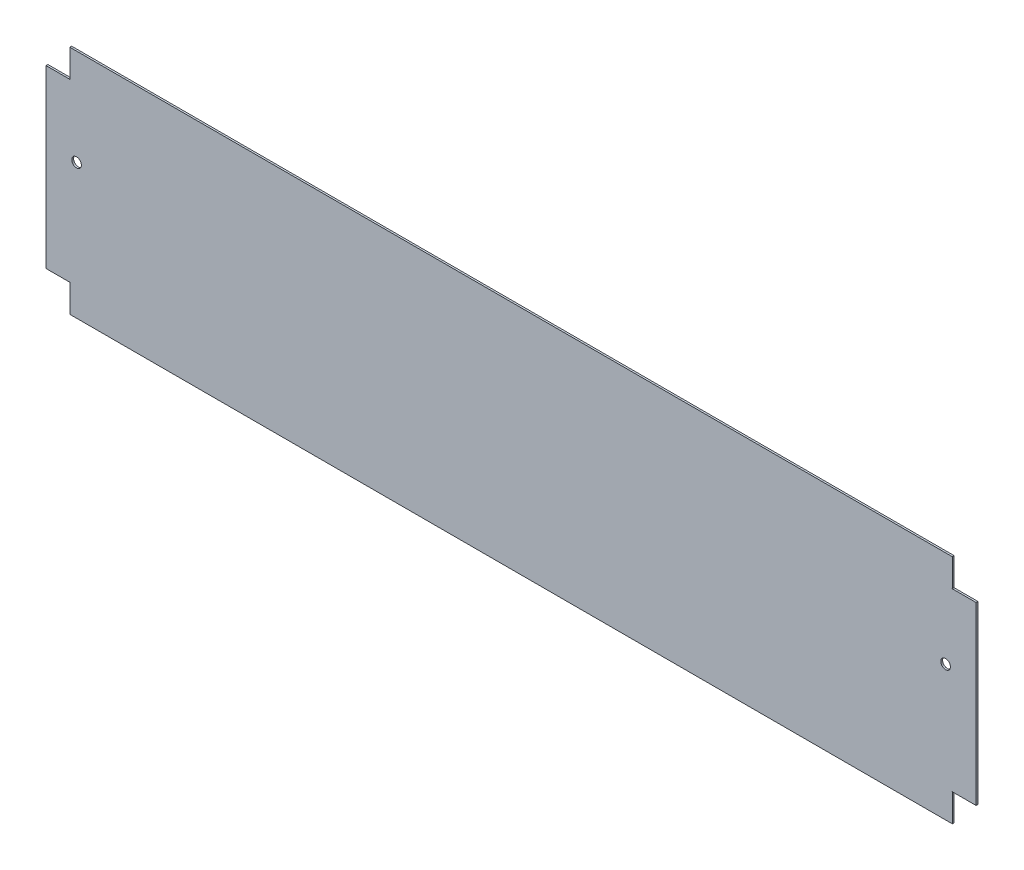
ISO-10303-21;
HEADER;
FILE_DESCRIPTION(('STEP AP214'),'2;1');
FILE_NAME('part.step','',(''),(''),'','','');
FILE_SCHEMA(('AUTOMOTIVE_DESIGN { 1 0 10303 214 1 1 1 1 }'));
ENDSEC;
DATA;
#1=APPLICATION_CONTEXT('core data for automotive mechanical design processes');
#2=APPLICATION_PROTOCOL_DEFINITION('international standard','automotive_design',2000,#1);
#3=PRODUCT_CONTEXT('',#1,'mechanical');
#4=PRODUCT('Part','Part','',(#3));
#5=PRODUCT_RELATED_PRODUCT_CATEGORY('part','',(#4));
#6=PRODUCT_DEFINITION_FORMATION('','',#4);
#7=PRODUCT_DEFINITION_CONTEXT('part definition',#1,'design');
#8=PRODUCT_DEFINITION('design','',#6,#7);
#9=PRODUCT_DEFINITION_SHAPE('','',#8);
#10=(LENGTH_UNIT() NAMED_UNIT(*) SI_UNIT(.MILLI.,.METRE.));
#11=(NAMED_UNIT(*) PLANE_ANGLE_UNIT() SI_UNIT($,.RADIAN.));
#12=(NAMED_UNIT(*) SI_UNIT($,.STERADIAN.) SOLID_ANGLE_UNIT());
#13=UNCERTAINTY_MEASURE_WITH_UNIT(LENGTH_MEASURE(1.E-05),#10,'distance_accuracy_value','');
#14=(GEOMETRIC_REPRESENTATION_CONTEXT(3) GLOBAL_UNCERTAINTY_ASSIGNED_CONTEXT((#13)) GLOBAL_UNIT_ASSIGNED_CONTEXT((#10,
#11,#12)) REPRESENTATION_CONTEXT('',''));
#15=CARTESIAN_POINT('',(0.,0.,0.));
#16=DIRECTION('',(0.,0.,1.));
#17=DIRECTION('',(1.,0.,0.));
#18=AXIS2_PLACEMENT_3D('',#15,#16,#17);
#19=CARTESIAN_POINT('',(0.,0.,-1.524));
#20=DIRECTION('',(0.,0.,-1.));
#21=DIRECTION('',(-1.,0.,0.));
#22=AXIS2_PLACEMENT_3D('',#19,#20,#21);
#23=PLANE('',#22);
#24=CARTESIAN_POINT('',(-357.251,15.875,-1.524));
#25=DIRECTION('',(0.,0.,-1.));
#26=DIRECTION('',(-1.,0.,0.));
#27=AXIS2_PLACEMENT_3D('',#24,#25,#26);
#28=CIRCLE('',#27,3.9624);
#29=CARTESIAN_POINT('',(-361.2134,15.875,-1.524));
#30=VERTEX_POINT('',#29);
#31=EDGE_CURVE('E367',#30,#30,#28,.T.);
#32=ORIENTED_EDGE('',*,*,#31,.F.);
#33=EDGE_LOOP('',(#32));
#34=FACE_BOUND('',#33,.T.);
#35=CARTESIAN_POINT('',(357.251,15.875,-1.524));
#36=DIRECTION('',(0.,0.,-1.));
#37=DIRECTION('',(-1.,0.,0.));
#38=AXIS2_PLACEMENT_3D('',#35,#36,#37);
#39=CIRCLE('',#38,3.9624);
#40=CARTESIAN_POINT('',(353.2886,15.875,-1.524));
#41=VERTEX_POINT('',#40);
#42=EDGE_CURVE('E360',#41,#41,#39,.T.);
#43=ORIENTED_EDGE('',*,*,#42,.F.);
#44=EDGE_LOOP('',(#43));
#45=FACE_BOUND('',#44,.T.);
#46=DIRECTION('',(0.,-1.,0.));
#47=VECTOR('',#46,1.);
#48=CARTESIAN_POINT('',(-362.6866,72.4153999999998,-1.52400000000003));
#49=LINE('',#48,#47);
#50=CARTESIAN_POINT('',(-362.6866,72.4153999999998,-1.524));
#51=VERTEX_POINT('',#50);
#52=CARTESIAN_POINT('',(-362.6866,72.2629999999998,-1.524));
#53=VERTEX_POINT('',#52);
#54=EDGE_CURVE('E152',#51,#53,#49,.T.);
#55=ORIENTED_EDGE('',*,*,#54,.F.);
#56=DIRECTION('',(1.,0.,0.));
#57=VECTOR('',#56,1.);
#58=CARTESIAN_POINT('',(-365.887,72.4153999999998,-1.52400000000003));
#59=LINE('',#58,#57);
#60=CARTESIAN_POINT('',(-362.7628,72.4153999999998,-1.524));
#61=VERTEX_POINT('',#60);
#62=EDGE_CURVE('E372',#61,#51,#59,.T.);
#63=ORIENTED_EDGE('',*,*,#62,.F.);
#64=DIRECTION('',(0.,1.,0.));
#65=VECTOR('',#64,1.);
#66=CARTESIAN_POINT('',(-362.7628,78.613,-1.524));
#67=LINE('',#66,#65);
#68=CARTESIAN_POINT('',(-362.7628,95.1099625310125,-1.5239999999999));
#69=VERTEX_POINT('',#68);
#70=EDGE_CURVE('E289',#61,#69,#67,.T.);
#71=ORIENTED_EDGE('',*,*,#70,.T.);
#72=DIRECTION('',(1.,0.,0.));
#73=VECTOR('',#72,1.);
#74=CARTESIAN_POINT('',(-362.7628,95.1099625310125,-1.5239999999999));
#75=LINE('',#74,#73);
#76=CARTESIAN_POINT('',(362.7628,95.1099625310125,-1.5239999999999));
#77=VERTEX_POINT('',#76);
#78=EDGE_CURVE('E287',#77,#69,#75,.F.);
#79=ORIENTED_EDGE('',*,*,#78,.F.);
#80=DIRECTION('',(0.,-1.,0.));
#81=VECTOR('',#80,1.);
#82=CARTESIAN_POINT('',(362.7628,78.613,-1.524));
#83=LINE('',#82,#81);
#84=CARTESIAN_POINT('',(362.7628,72.4153999999999,-1.52400000000003));
#85=VERTEX_POINT('',#84);
#86=EDGE_CURVE('E274',#77,#85,#83,.T.);
#87=ORIENTED_EDGE('',*,*,#86,.T.);
#88=DIRECTION('',(1.,0.,0.));
#89=VECTOR('',#88,1.);
#90=CARTESIAN_POINT('',(362.6866,72.4153999999999,-1.52400000000003));
#91=LINE('',#90,#89);
#92=CARTESIAN_POINT('',(362.6866,72.4153999999999,-1.52400000000003));
#93=VERTEX_POINT('',#92);
#94=EDGE_CURVE('E423',#93,#85,#91,.T.);
#95=ORIENTED_EDGE('',*,*,#94,.F.);
#96=DIRECTION('',(0.,1.,0.));
#97=VECTOR('',#96,1.);
#98=CARTESIAN_POINT('',(362.6866,72.2629999999999,-1.52400000000003));
#99=LINE('',#98,#97);
#100=CARTESIAN_POINT('',(362.6866,72.2629999999999,-1.52400000000003));
#101=VERTEX_POINT('',#100);
#102=EDGE_CURVE('E417',#101,#93,#99,.T.);
#103=ORIENTED_EDGE('',*,*,#102,.F.);
#104=DIRECTION('',(1.,0.,0.));
#105=VECTOR('',#104,1.);
#106=CARTESIAN_POINT('',(365.887,72.263,-1.524));
#107=LINE('',#106,#105);
#108=CARTESIAN_POINT('',(382.383962531012,72.2630000000003,-1.52399999999991));
#109=VERTEX_POINT('',#108);
#110=EDGE_CURVE('E284',#101,#109,#107,.T.);
#111=ORIENTED_EDGE('',*,*,#110,.T.);
#112=DIRECTION('',(0.,-1.,0.));
#113=VECTOR('',#112,1.);
#114=CARTESIAN_POINT('',(382.383962531012,72.2630000000003,-1.52399999999991));
#115=LINE('',#114,#113);
#116=CARTESIAN_POINT('',(382.383962531012,-72.2629999999997,-1.5239999999998));
#117=VERTEX_POINT('',#116);
#118=EDGE_CURVE('E320',#117,#109,#115,.F.);
#119=ORIENTED_EDGE('',*,*,#118,.F.);
#120=DIRECTION('',(-1.,0.,0.));
#121=VECTOR('',#120,1.);
#122=CARTESIAN_POINT('',(365.887,-72.263,-1.524));
#123=LINE('',#122,#121);
#124=CARTESIAN_POINT('',(362.6866,-72.263,-1.524));
#125=VERTEX_POINT('',#124);
#126=EDGE_CURVE('E449',#117,#125,#123,.T.);
#127=ORIENTED_EDGE('',*,*,#126,.T.);
#128=DIRECTION('',(0.,1.,0.));
#129=VECTOR('',#128,1.);
#130=CARTESIAN_POINT('',(362.6866,-72.4154,-1.52400000000003));
#131=LINE('',#130,#129);
#132=CARTESIAN_POINT('',(362.6866,-72.4154,-1.524));
#133=VERTEX_POINT('',#132);
#134=EDGE_CURVE('E412',#133,#125,#131,.T.);
#135=ORIENTED_EDGE('',*,*,#134,.F.);
#136=DIRECTION('',(-1.,0.,0.));
#137=VECTOR('',#136,1.);
#138=CARTESIAN_POINT('',(365.887,-72.4154,-1.52400000000003));
#139=LINE('',#138,#137);
#140=CARTESIAN_POINT('',(362.7628,-72.4154,-1.524));
#141=VERTEX_POINT('',#140);
#142=EDGE_CURVE('E407',#141,#133,#139,.T.);
#143=ORIENTED_EDGE('',*,*,#142,.F.);
#144=DIRECTION('',(0.,-1.,0.));
#145=VECTOR('',#144,1.);
#146=CARTESIAN_POINT('',(362.7628,-78.613,-1.524));
#147=LINE('',#146,#145);
#148=CARTESIAN_POINT('',(362.7628,-95.1099625310125,-1.52399999999989));
#149=VERTEX_POINT('',#148);
#150=EDGE_CURVE('E444',#141,#149,#147,.T.);
#151=ORIENTED_EDGE('',*,*,#150,.T.);
#152=DIRECTION('',(-1.,0.,0.));
#153=VECTOR('',#152,1.);
#154=CARTESIAN_POINT('',(362.7628,-95.1099625310125,-1.52399999999989));
#155=LINE('',#154,#153);
#156=CARTESIAN_POINT('',(-362.7628,-95.1099625310125,-1.5239999999999));
#157=VERTEX_POINT('',#156);
#158=EDGE_CURVE('E311',#157,#149,#155,.F.);
#159=ORIENTED_EDGE('',*,*,#158,.F.);
#160=DIRECTION('',(0.,1.,0.));
#161=VECTOR('',#160,1.);
#162=CARTESIAN_POINT('',(-362.7628,-78.613,-1.524));
#163=LINE('',#162,#161);
#164=CARTESIAN_POINT('',(-362.7628,-72.4154,-1.52400000000003));
#165=VERTEX_POINT('',#164);
#166=EDGE_CURVE('E460',#157,#165,#163,.T.);
#167=ORIENTED_EDGE('',*,*,#166,.T.);
#168=DIRECTION('',(-1.,0.,0.));
#169=VECTOR('',#168,1.);
#170=CARTESIAN_POINT('',(-362.6866,-72.4154,-1.52400000000003));
#171=LINE('',#170,#169);
#172=CARTESIAN_POINT('',(-362.6866,-72.4154,-1.52400000000003));
#173=VERTEX_POINT('',#172);
#174=EDGE_CURVE('E385',#173,#165,#171,.T.);
#175=ORIENTED_EDGE('',*,*,#174,.F.);
#176=DIRECTION('',(0.,-1.,0.));
#177=VECTOR('',#176,1.);
#178=CARTESIAN_POINT('',(-362.6866,-72.263,-1.52400000000003));
#179=LINE('',#178,#177);
#180=CARTESIAN_POINT('',(-362.6866,-72.263,-1.52400000000003));
#181=VERTEX_POINT('',#180);
#182=EDGE_CURVE('E379',#181,#173,#179,.T.);
#183=ORIENTED_EDGE('',*,*,#182,.F.);
#184=DIRECTION('',(-1.,0.,0.));
#185=VECTOR('',#184,1.);
#186=CARTESIAN_POINT('',(-365.887,-72.2630000000001,-1.524));
#187=LINE('',#186,#185);
#188=CARTESIAN_POINT('',(-382.383962531012,-72.2630000000004,-1.52399999999991));
#189=VERTEX_POINT('',#188);
#190=EDGE_CURVE('E465',#181,#189,#187,.T.);
#191=ORIENTED_EDGE('',*,*,#190,.T.);
#192=DIRECTION('',(0.,1.,0.));
#193=VECTOR('',#192,1.);
#194=CARTESIAN_POINT('',(-382.383962531012,-72.2630000000004,-1.52399999999991));
#195=LINE('',#194,#193);
#196=CARTESIAN_POINT('',(-382.383962531012,72.2629999999996,-1.5239999999998));
#197=VERTEX_POINT('',#196);
#198=EDGE_CURVE('E328',#197,#189,#195,.F.);
#199=ORIENTED_EDGE('',*,*,#198,.F.);
#200=DIRECTION('',(1.,0.,0.));
#201=VECTOR('',#200,1.);
#202=CARTESIAN_POINT('',(-365.887,72.2629999999999,-1.524));
#203=LINE('',#202,#201);
#204=EDGE_CURVE('E157',#197,#53,#203,.T.);
#205=ORIENTED_EDGE('',*,*,#204,.T.);
#206=EDGE_LOOP('',(#55,#63,#71,#79,#87,#95,#103,#111,#119,#127,#135,#143,#151,#159,#167,#175,
#183,#191,#199,#205));
#207=FACE_BOUND('',#206,.T.);
#208=ADVANCED_FACE('F136',(#34,#45,#207),#23,.T.);
#209=CARTESIAN_POINT('',(0.,0.,0.));
#210=DIRECTION('',(0.,0.,-1.));
#211=DIRECTION('',(-1.,0.,0.));
#212=AXIS2_PLACEMENT_3D('',#209,#210,#211);
#213=PLANE('',#212);
#214=CARTESIAN_POINT('',(-357.251,15.875,0.));
#215=DIRECTION('',(0.,0.,1.));
#216=DIRECTION('',(1.,0.,0.));
#217=AXIS2_PLACEMENT_3D('',#214,#215,#216);
#218=CIRCLE('',#217,3.9624);
#219=CARTESIAN_POINT('',(-353.2886,15.875,0.));
#220=VERTEX_POINT('',#219);
#221=EDGE_CURVE('E356',#220,#220,#218,.T.);
#222=ORIENTED_EDGE('',*,*,#221,.F.);
#223=EDGE_LOOP('',(#222));
#224=FACE_BOUND('',#223,.T.);
#225=CARTESIAN_POINT('',(357.251,15.875,0.));
#226=DIRECTION('',(0.,0.,1.));
#227=DIRECTION('',(1.,0.,0.));
#228=AXIS2_PLACEMENT_3D('',#225,#226,#227);
#229=CIRCLE('',#228,3.9624);
#230=CARTESIAN_POINT('',(361.2134,15.875,0.));
#231=VERTEX_POINT('',#230);
#232=EDGE_CURVE('E344',#231,#231,#229,.T.);
#233=ORIENTED_EDGE('',*,*,#232,.F.);
#234=EDGE_LOOP('',(#233));
#235=FACE_BOUND('',#234,.T.);
#236=DIRECTION('',(-1.,0.,0.));
#237=VECTOR('',#236,1.);
#238=CARTESIAN_POINT('',(0.,72.4153999999998,0.));
#239=LINE('',#238,#237);
#240=CARTESIAN_POINT('',(-362.6866,72.4153999999998,0.));
#241=VERTEX_POINT('',#240);
#242=CARTESIAN_POINT('',(-362.7628,72.4153999999998,0.));
#243=VERTEX_POINT('',#242);
#244=EDGE_CURVE('E375',#241,#243,#239,.T.);
#245=ORIENTED_EDGE('',*,*,#244,.F.);
#246=DIRECTION('',(0.,1.,0.));
#247=VECTOR('',#246,1.);
#248=CARTESIAN_POINT('',(-362.6866,0.,0.));
#249=LINE('',#248,#247);
#250=CARTESIAN_POINT('',(-362.6866,72.2629999999998,0.));
#251=VERTEX_POINT('',#250);
#252=EDGE_CURVE('E13',#251,#241,#249,.T.);
#253=ORIENTED_EDGE('',*,*,#252,.F.);
#254=DIRECTION('',(1.,0.,0.));
#255=VECTOR('',#254,1.);
#256=CARTESIAN_POINT('',(-365.887,72.2629999999999,0.));
#257=LINE('',#256,#255);
#258=CARTESIAN_POINT('',(-382.383962531012,72.2629999999996,2.22044604925031E-13));
#259=VERTEX_POINT('',#258);
#260=EDGE_CURVE('E464',#259,#251,#257,.T.);
#261=ORIENTED_EDGE('',*,*,#260,.F.);
#262=DIRECTION('',(0.,-1.,0.));
#263=VECTOR('',#262,1.);
#264=CARTESIAN_POINT('',(-382.383962531012,-2.81067885232432E-13,1.66533453693773E-13));
#265=LINE('',#264,#263);
#266=CARTESIAN_POINT('',(-382.383962531012,-72.2630000000004,1.11022302462516E-13));
#267=VERTEX_POINT('',#266);
#268=EDGE_CURVE('E340',#259,#267,#265,.T.);
#269=ORIENTED_EDGE('',*,*,#268,.T.);
#270=DIRECTION('',(-1.,0.,0.));
#271=VECTOR('',#270,1.);
#272=CARTESIAN_POINT('',(-365.887,-72.2630000000001,0.));
#273=LINE('',#272,#271);
#274=CARTESIAN_POINT('',(-362.6866,-72.263,0.));
#275=VERTEX_POINT('',#274);
#276=EDGE_CURVE('E456',#275,#267,#273,.T.);
#277=ORIENTED_EDGE('',*,*,#276,.F.);
#278=DIRECTION('',(0.,1.,0.));
#279=VECTOR('',#278,1.);
#280=CARTESIAN_POINT('',(-362.6866,0.,0.));
#281=LINE('',#280,#279);
#282=CARTESIAN_POINT('',(-362.6866,-72.4154,0.));
#283=VERTEX_POINT('',#282);
#284=EDGE_CURVE('E145',#283,#275,#281,.T.);
#285=ORIENTED_EDGE('',*,*,#284,.F.);
#286=DIRECTION('',(1.,0.,0.));
#287=VECTOR('',#286,1.);
#288=CARTESIAN_POINT('',(0.,-72.4154,0.));
#289=LINE('',#288,#287);
#290=CARTESIAN_POINT('',(-362.7628,-72.4154,0.));
#291=VERTEX_POINT('',#290);
#292=EDGE_CURVE('E403',#291,#283,#289,.T.);
#293=ORIENTED_EDGE('',*,*,#292,.F.);
#294=DIRECTION('',(0.,1.,0.));
#295=VECTOR('',#294,1.);
#296=CARTESIAN_POINT('',(-362.7628,-78.613,0.));
#297=LINE('',#296,#295);
#298=CARTESIAN_POINT('',(-362.7628,-95.1099625310124,0.));
#299=VERTEX_POINT('',#298);
#300=EDGE_CURVE('E459',#299,#291,#297,.T.);
#301=ORIENTED_EDGE('',*,*,#300,.F.);
#302=DIRECTION('',(1.,0.,0.));
#303=VECTOR('',#302,1.);
#304=CARTESIAN_POINT('',(0.,-95.1099625310124,0.));
#305=LINE('',#304,#303);
#306=CARTESIAN_POINT('',(362.7628,-95.1099625310124,1.11022302462516E-13));
#307=VERTEX_POINT('',#306);
#308=EDGE_CURVE('E324',#299,#307,#305,.T.);
#309=ORIENTED_EDGE('',*,*,#308,.T.);
#310=DIRECTION('',(0.,-1.,0.));
#311=VECTOR('',#310,1.);
#312=CARTESIAN_POINT('',(362.7628,-78.613,0.));
#313=LINE('',#312,#311);
#314=CARTESIAN_POINT('',(362.7628,-72.4154,0.));
#315=VERTEX_POINT('',#314);
#316=EDGE_CURVE('E445',#315,#307,#313,.T.);
#317=ORIENTED_EDGE('',*,*,#316,.F.);
#318=DIRECTION('',(1.,0.,0.));
#319=VECTOR('',#318,1.);
#320=CARTESIAN_POINT('',(0.,-72.4154,0.));
#321=LINE('',#320,#319);
#322=CARTESIAN_POINT('',(362.6866,-72.4154,0.));
#323=VERTEX_POINT('',#322);
#324=EDGE_CURVE('E411',#323,#315,#321,.T.);
#325=ORIENTED_EDGE('',*,*,#324,.F.);
#326=DIRECTION('',(0.,-1.,0.));
#327=VECTOR('',#326,1.);
#328=CARTESIAN_POINT('',(362.6866,0.,0.));
#329=LINE('',#328,#327);
#330=CARTESIAN_POINT('',(362.6866,-72.263,0.));
#331=VERTEX_POINT('',#330);
#332=EDGE_CURVE('E497',#331,#323,#329,.T.);
#333=ORIENTED_EDGE('',*,*,#332,.F.);
#334=DIRECTION('',(-1.,0.,0.));
#335=VECTOR('',#334,1.);
#336=CARTESIAN_POINT('',(365.887,-72.263,0.));
#337=LINE('',#336,#335);
#338=CARTESIAN_POINT('',(382.383962531012,-72.2629999999997,2.22044604925031E-13));
#339=VERTEX_POINT('',#338);
#340=EDGE_CURVE('E448',#339,#331,#337,.T.);
#341=ORIENTED_EDGE('',*,*,#340,.F.);
#342=DIRECTION('',(0.,1.,0.));
#343=VECTOR('',#342,1.);
#344=CARTESIAN_POINT('',(382.383962531012,2.81067885232432E-13,1.66533453693773E-13));
#345=LINE('',#344,#343);
#346=CARTESIAN_POINT('',(382.383962531012,72.2630000000003,1.11022302462516E-13));
#347=VERTEX_POINT('',#346);
#348=EDGE_CURVE('E307',#339,#347,#345,.T.);
#349=ORIENTED_EDGE('',*,*,#348,.T.);
#350=DIRECTION('',(1.,0.,0.));
#351=VECTOR('',#350,1.);
#352=CARTESIAN_POINT('',(365.887,72.263,0.));
#353=LINE('',#352,#351);
#354=CARTESIAN_POINT('',(362.6866,72.2629999999999,0.));
#355=VERTEX_POINT('',#354);
#356=EDGE_CURVE('E283',#355,#347,#353,.T.);
#357=ORIENTED_EDGE('',*,*,#356,.F.);
#358=DIRECTION('',(0.,-1.,0.));
#359=VECTOR('',#358,1.);
#360=CARTESIAN_POINT('',(362.6866,0.,0.));
#361=LINE('',#360,#359);
#362=CARTESIAN_POINT('',(362.6866,72.4153999999999,0.));
#363=VERTEX_POINT('',#362);
#364=EDGE_CURVE('E493',#363,#355,#361,.T.);
#365=ORIENTED_EDGE('',*,*,#364,.F.);
#366=DIRECTION('',(-1.,0.,0.));
#367=VECTOR('',#366,1.);
#368=CARTESIAN_POINT('',(0.,72.4153999999999,0.));
#369=LINE('',#368,#367);
#370=CARTESIAN_POINT('',(362.7628,72.4153999999999,0.));
#371=VERTEX_POINT('',#370);
#372=EDGE_CURVE('E441',#371,#363,#369,.T.);
#373=ORIENTED_EDGE('',*,*,#372,.F.);
#374=DIRECTION('',(0.,-1.,0.));
#375=VECTOR('',#374,1.);
#376=CARTESIAN_POINT('',(362.7628,78.613,0.));
#377=LINE('',#376,#375);
#378=CARTESIAN_POINT('',(362.7628,95.1099625310125,0.));
#379=VERTEX_POINT('',#378);
#380=EDGE_CURVE('E468',#379,#371,#377,.T.);
#381=ORIENTED_EDGE('',*,*,#380,.F.);
#382=DIRECTION('',(-1.,0.,0.));
#383=VECTOR('',#382,1.);
#384=CARTESIAN_POINT('',(0.,95.1099625310125,0.));
#385=LINE('',#384,#383);
#386=CARTESIAN_POINT('',(-362.7628,95.1099625310125,0.));
#387=VERTEX_POINT('',#386);
#388=EDGE_CURVE('E298',#379,#387,#385,.T.);
#389=ORIENTED_EDGE('',*,*,#388,.T.);
#390=DIRECTION('',(0.,1.,0.));
#391=VECTOR('',#390,1.);
#392=CARTESIAN_POINT('',(-362.7628,78.613,0.));
#393=LINE('',#392,#391);
#394=EDGE_CURVE('E480',#243,#387,#393,.T.);
#395=ORIENTED_EDGE('',*,*,#394,.F.);
#396=EDGE_LOOP('',(#245,#253,#261,#269,#277,#285,#293,#301,#309,#317,#325,#333,#341,#349,#357,
#365,#373,#381,#389,#395));
#397=FACE_BOUND('',#396,.T.);
#398=ADVANCED_FACE('F138',(#224,#235,#397),#213,.F.);
#399=CARTESIAN_POINT('',(-362.7628,-78.613,-1.524));
#400=DIRECTION('',(1.,0.,0.));
#401=DIRECTION('',(0.,1.,0.));
#402=AXIS2_PLACEMENT_3D('',#399,#400,#401);
#403=PLANE('',#402);
#404=DIRECTION('',(0.,0.,1.));
#405=VECTOR('',#404,1.);
#406=CARTESIAN_POINT('',(-362.7628,-72.4154,-1.524));
#407=LINE('',#406,#405);
#408=EDGE_CURVE('E505',#165,#291,#407,.T.);
#409=ORIENTED_EDGE('',*,*,#408,.F.);
#410=ORIENTED_EDGE('',*,*,#166,.F.);
#411=DIRECTION('',(0.,0.,-1.));
#412=VECTOR('',#411,1.);
#413=CARTESIAN_POINT('',(-362.7628,-95.1099625310124,0.));
#414=LINE('',#413,#412);
#415=EDGE_CURVE('E333',#299,#157,#414,.T.);
#416=ORIENTED_EDGE('',*,*,#415,.F.);
#417=ORIENTED_EDGE('',*,*,#300,.T.);
#418=EDGE_LOOP('',(#409,#410,#416,#417));
#419=FACE_BOUND('',#418,.T.);
#420=ADVANCED_FACE('F634',(#419),#403,.F.);
#421=CARTESIAN_POINT('',(-362.7628,78.613,-1.524));
#422=DIRECTION('',(1.,0.,0.));
#423=DIRECTION('',(0.,0.,-1.));
#424=AXIS2_PLACEMENT_3D('',#421,#422,#423);
#425=PLANE('',#424);
#426=DIRECTION('',(0.,0.,-1.));
#427=VECTOR('',#426,1.);
#428=CARTESIAN_POINT('',(-362.7628,72.4153999999998,-1.524));
#429=LINE('',#428,#427);
#430=EDGE_CURVE('E501',#243,#61,#429,.T.);
#431=ORIENTED_EDGE('',*,*,#430,.F.);
#432=ORIENTED_EDGE('',*,*,#394,.T.);
#433=DIRECTION('',(0.,0.,-1.));
#434=VECTOR('',#433,1.);
#435=CARTESIAN_POINT('',(-362.7628,95.1099625310125,0.));
#436=LINE('',#435,#434);
#437=EDGE_CURVE('E300',#387,#69,#436,.T.);
#438=ORIENTED_EDGE('',*,*,#437,.T.);
#439=ORIENTED_EDGE('',*,*,#70,.F.);
#440=EDGE_LOOP('',(#431,#432,#438,#439));
#441=FACE_BOUND('',#440,.T.);
#442=ADVANCED_FACE('F534',(#441),#425,.F.);
#443=CARTESIAN_POINT('',(-365.887,72.2629999999999,-1.524));
#444=DIRECTION('',(0.,-1.,0.));
#445=DIRECTION('',(0.,0.,-1.));
#446=AXIS2_PLACEMENT_3D('',#443,#444,#445);
#447=PLANE('',#446);
#448=ORIENTED_EDGE('',*,*,#204,.F.);
#449=DIRECTION('',(0.,0.,-1.));
#450=VECTOR('',#449,1.);
#451=CARTESIAN_POINT('',(-382.383962531012,72.2629999999996,2.22044604925031E-13));
#452=LINE('',#451,#450);
#453=EDGE_CURVE('E349',#259,#197,#452,.T.);
#454=ORIENTED_EDGE('',*,*,#453,.F.);
#455=ORIENTED_EDGE('',*,*,#260,.T.);
#456=DIRECTION('',(0.,0.,1.));
#457=VECTOR('',#456,1.);
#458=CARTESIAN_POINT('',(-362.6866,72.2629999999998,-1.52400000000003));
#459=LINE('',#458,#457);
#460=EDGE_CURVE('E383',#53,#251,#459,.T.);
#461=ORIENTED_EDGE('',*,*,#460,.F.);
#462=EDGE_LOOP('',(#448,#454,#455,#461));
#463=FACE_BOUND('',#462,.T.);
#464=ADVANCED_FACE('F526',(#463),#447,.F.);
#465=CARTESIAN_POINT('',(-365.887,-72.2630000000001,-1.524));
#466=DIRECTION('',(0.,1.,0.));
#467=DIRECTION('',(0.,0.,1.));
#468=AXIS2_PLACEMENT_3D('',#465,#466,#467);
#469=PLANE('',#468);
#470=ORIENTED_EDGE('',*,*,#276,.T.);
#471=DIRECTION('',(0.,0.,-1.));
#472=VECTOR('',#471,1.);
#473=CARTESIAN_POINT('',(-382.383962531012,-72.2630000000004,1.11022302462516E-13));
#474=LINE('',#473,#472);
#475=EDGE_CURVE('E345',#267,#189,#474,.T.);
#476=ORIENTED_EDGE('',*,*,#475,.T.);
#477=ORIENTED_EDGE('',*,*,#190,.F.);
#478=DIRECTION('',(0.,0.,1.));
#479=VECTOR('',#478,1.);
#480=CARTESIAN_POINT('',(-362.6866,-72.263,-1.52400000000003));
#481=LINE('',#480,#479);
#482=EDGE_CURVE('E384',#181,#275,#481,.T.);
#483=ORIENTED_EDGE('',*,*,#482,.T.);
#484=EDGE_LOOP('',(#470,#476,#477,#483));
#485=FACE_BOUND('',#484,.T.);
#486=ADVANCED_FACE('F518',(#485),#469,.F.);
#487=CARTESIAN_POINT('',(362.7628,-78.613,-1.524));
#488=DIRECTION('',(-1.,0.,0.));
#489=DIRECTION('',(0.,-1.,0.));
#490=AXIS2_PLACEMENT_3D('',#487,#488,#489);
#491=PLANE('',#490);
#492=ORIENTED_EDGE('',*,*,#316,.T.);
#493=DIRECTION('',(0.,0.,-1.));
#494=VECTOR('',#493,1.);
#495=CARTESIAN_POINT('',(362.7628,-95.1099625310124,1.11022302462516E-13));
#496=LINE('',#495,#494);
#497=EDGE_CURVE('E329',#307,#149,#496,.T.);
#498=ORIENTED_EDGE('',*,*,#497,.T.);
#499=ORIENTED_EDGE('',*,*,#150,.F.);
#500=DIRECTION('',(0.,0.,-1.));
#501=VECTOR('',#500,1.);
#502=CARTESIAN_POINT('',(362.7628,-72.4154,-1.524));
#503=LINE('',#502,#501);
#504=EDGE_CURVE('E483',#315,#141,#503,.T.);
#505=ORIENTED_EDGE('',*,*,#504,.F.);
#506=EDGE_LOOP('',(#492,#498,#499,#505));
#507=FACE_BOUND('',#506,.T.);
#508=ADVANCED_FACE('F627',(#507),#491,.F.);
#509=CARTESIAN_POINT('',(362.7628,78.613,-1.524));
#510=DIRECTION('',(-1.,0.,0.));
#511=DIRECTION('',(0.,0.,1.));
#512=AXIS2_PLACEMENT_3D('',#509,#510,#511);
#513=PLANE('',#512);
#514=DIRECTION('',(0.,0.,1.));
#515=VECTOR('',#514,1.);
#516=CARTESIAN_POINT('',(362.7628,72.4153999999999,-1.524));
#517=LINE('',#516,#515);
#518=EDGE_CURVE('E280',#85,#371,#517,.T.);
#519=ORIENTED_EDGE('',*,*,#518,.F.);
#520=ORIENTED_EDGE('',*,*,#86,.F.);
#521=DIRECTION('',(0.,0.,-1.));
#522=VECTOR('',#521,1.);
#523=CARTESIAN_POINT('',(362.7628,95.1099625310125,0.));
#524=LINE('',#523,#522);
#525=EDGE_CURVE('E279',#379,#77,#524,.T.);
#526=ORIENTED_EDGE('',*,*,#525,.F.);
#527=ORIENTED_EDGE('',*,*,#380,.T.);
#528=EDGE_LOOP('',(#519,#520,#526,#527));
#529=FACE_BOUND('',#528,.T.);
#530=ADVANCED_FACE('F276',(#529),#513,.F.);
#531=CARTESIAN_POINT('',(365.887,-72.263,-1.524));
#532=DIRECTION('',(0.,1.,0.));
#533=DIRECTION('',(0.,0.,1.));
#534=AXIS2_PLACEMENT_3D('',#531,#532,#533);
#535=PLANE('',#534);
#536=ORIENTED_EDGE('',*,*,#126,.F.);
#537=DIRECTION('',(0.,0.,-1.));
#538=VECTOR('',#537,1.);
#539=CARTESIAN_POINT('',(382.383962531012,-72.2629999999997,2.22044604925031E-13));
#540=LINE('',#539,#538);
#541=EDGE_CURVE('E316',#339,#117,#540,.T.);
#542=ORIENTED_EDGE('',*,*,#541,.F.);
#543=ORIENTED_EDGE('',*,*,#340,.T.);
#544=DIRECTION('',(0.,0.,1.));
#545=VECTOR('',#544,1.);
#546=CARTESIAN_POINT('',(362.6866,-72.263,-1.52400000000003));
#547=LINE('',#546,#545);
#548=EDGE_CURVE('E421',#125,#331,#547,.T.);
#549=ORIENTED_EDGE('',*,*,#548,.F.);
#550=EDGE_LOOP('',(#536,#542,#543,#549));
#551=FACE_BOUND('',#550,.T.);
#552=ADVANCED_FACE('F615',(#551),#535,.F.);
#553=CARTESIAN_POINT('',(365.887,72.263,-1.524));
#554=DIRECTION('',(0.,-1.,0.));
#555=DIRECTION('',(0.,0.,-1.));
#556=AXIS2_PLACEMENT_3D('',#553,#554,#555);
#557=PLANE('',#556);
#558=ORIENTED_EDGE('',*,*,#356,.T.);
#559=DIRECTION('',(0.,0.,-1.));
#560=VECTOR('',#559,1.);
#561=CARTESIAN_POINT('',(382.383962531012,72.2630000000003,1.11022302462516E-13));
#562=LINE('',#561,#560);
#563=EDGE_CURVE('E312',#347,#109,#562,.T.);
#564=ORIENTED_EDGE('',*,*,#563,.T.);
#565=ORIENTED_EDGE('',*,*,#110,.F.);
#566=DIRECTION('',(0.,0.,1.));
#567=VECTOR('',#566,1.);
#568=CARTESIAN_POINT('',(362.6866,72.2629999999999,-1.52400000000003));
#569=LINE('',#568,#567);
#570=EDGE_CURVE('E422',#101,#355,#569,.T.);
#571=ORIENTED_EDGE('',*,*,#570,.T.);
#572=EDGE_LOOP('',(#558,#564,#565,#571));
#573=FACE_BOUND('',#572,.T.);
#574=ADVANCED_FACE('F612',(#573),#557,.F.);
#575=CARTESIAN_POINT('',(362.6866,72.4153999999999,-1.52400000000003));
#576=DIRECTION('',(0.,-1.,0.));
#577=DIRECTION('',(0.,0.,-1.));
#578=AXIS2_PLACEMENT_3D('',#575,#576,#577);
#579=PLANE('',#578);
#580=ORIENTED_EDGE('',*,*,#518,.T.);
#581=ORIENTED_EDGE('',*,*,#372,.T.);
#582=DIRECTION('',(0.,0.,1.));
#583=VECTOR('',#582,1.);
#584=CARTESIAN_POINT('',(362.6866,72.4153999999999,-1.52400000000003));
#585=LINE('',#584,#583);
#586=EDGE_CURVE('E406',#93,#363,#585,.T.);
#587=ORIENTED_EDGE('',*,*,#586,.F.);
#588=ORIENTED_EDGE('',*,*,#94,.T.);
#589=EDGE_LOOP('',(#580,#581,#587,#588));
#590=FACE_BOUND('',#589,.T.);
#591=ADVANCED_FACE('F600',(#590),#579,.T.);
#592=CARTESIAN_POINT('',(362.6866,72.2629999999999,-1.52400000000003));
#593=DIRECTION('',(1.,0.,0.));
#594=DIRECTION('',(0.,0.,-1.));
#595=AXIS2_PLACEMENT_3D('',#592,#593,#594);
#596=PLANE('',#595);
#597=ORIENTED_EDGE('',*,*,#586,.T.);
#598=ORIENTED_EDGE('',*,*,#364,.T.);
#599=ORIENTED_EDGE('',*,*,#570,.F.);
#600=ORIENTED_EDGE('',*,*,#102,.T.);
#601=EDGE_LOOP('',(#597,#598,#599,#600));
#602=FACE_BOUND('',#601,.T.);
#603=ADVANCED_FACE('F602',(#602),#596,.T.);
#604=CARTESIAN_POINT('',(362.6866,-72.4154,-1.52400000000003));
#605=DIRECTION('',(1.,0.,0.));
#606=DIRECTION('',(0.,0.,-1.));
#607=AXIS2_PLACEMENT_3D('',#604,#605,#606);
#608=PLANE('',#607);
#609=ORIENTED_EDGE('',*,*,#548,.T.);
#610=ORIENTED_EDGE('',*,*,#332,.T.);
#611=DIRECTION('',(0.,0.,1.));
#612=VECTOR('',#611,1.);
#613=CARTESIAN_POINT('',(362.6866,-72.4154,-1.52400000000003));
#614=LINE('',#613,#612);
#615=EDGE_CURVE('E416',#133,#323,#614,.T.);
#616=ORIENTED_EDGE('',*,*,#615,.F.);
#617=ORIENTED_EDGE('',*,*,#134,.T.);
#618=EDGE_LOOP('',(#609,#610,#616,#617));
#619=FACE_BOUND('',#618,.T.);
#620=ADVANCED_FACE('F622',(#619),#608,.T.);
#621=CARTESIAN_POINT('',(365.887,-72.4154,-1.52400000000003));
#622=DIRECTION('',(0.,1.,0.));
#623=DIRECTION('',(0.,0.,1.));
#624=AXIS2_PLACEMENT_3D('',#621,#622,#623);
#625=PLANE('',#624);
#626=ORIENTED_EDGE('',*,*,#615,.T.);
#627=ORIENTED_EDGE('',*,*,#324,.T.);
#628=ORIENTED_EDGE('',*,*,#504,.T.);
#629=ORIENTED_EDGE('',*,*,#142,.T.);
#630=EDGE_LOOP('',(#626,#627,#628,#629));
#631=FACE_BOUND('',#630,.T.);
#632=ADVANCED_FACE('F621',(#631),#625,.T.);
#633=CARTESIAN_POINT('',(-362.6866,-72.4154,-1.52400000000003));
#634=DIRECTION('',(0.,1.,0.));
#635=DIRECTION('',(0.,0.,1.));
#636=AXIS2_PLACEMENT_3D('',#633,#634,#635);
#637=PLANE('',#636);
#638=ORIENTED_EDGE('',*,*,#408,.T.);
#639=ORIENTED_EDGE('',*,*,#292,.T.);
#640=DIRECTION('',(0.,0.,1.));
#641=VECTOR('',#640,1.);
#642=CARTESIAN_POINT('',(-362.6866,-72.4154,-1.52400000000003));
#643=LINE('',#642,#641);
#644=EDGE_CURVE('E371',#173,#283,#643,.T.);
#645=ORIENTED_EDGE('',*,*,#644,.F.);
#646=ORIENTED_EDGE('',*,*,#174,.T.);
#647=EDGE_LOOP('',(#638,#639,#645,#646));
#648=FACE_BOUND('',#647,.T.);
#649=ADVANCED_FACE('F636',(#648),#637,.T.);
#650=CARTESIAN_POINT('',(-362.6866,-72.263,-1.52400000000003));
#651=DIRECTION('',(-1.,0.,0.));
#652=DIRECTION('',(0.,0.,1.));
#653=AXIS2_PLACEMENT_3D('',#650,#651,#652);
#654=PLANE('',#653);
#655=ORIENTED_EDGE('',*,*,#644,.T.);
#656=ORIENTED_EDGE('',*,*,#284,.T.);
#657=ORIENTED_EDGE('',*,*,#482,.F.);
#658=ORIENTED_EDGE('',*,*,#182,.T.);
#659=EDGE_LOOP('',(#655,#656,#657,#658));
#660=FACE_BOUND('',#659,.T.);
#661=ADVANCED_FACE('F513',(#660),#654,.T.);
#662=CARTESIAN_POINT('',(-362.6866,72.4153999999998,-1.52400000000003));
#663=DIRECTION('',(-1.,0.,0.));
#664=DIRECTION('',(0.,0.,1.));
#665=AXIS2_PLACEMENT_3D('',#662,#663,#664);
#666=PLANE('',#665);
#667=ORIENTED_EDGE('',*,*,#460,.T.);
#668=ORIENTED_EDGE('',*,*,#252,.T.);
#669=DIRECTION('',(0.,0.,1.));
#670=VECTOR('',#669,1.);
#671=CARTESIAN_POINT('',(-362.6866,72.4153999999998,-1.52400000000003));
#672=LINE('',#671,#670);
#673=EDGE_CURVE('E378',#51,#241,#672,.T.);
#674=ORIENTED_EDGE('',*,*,#673,.F.);
#675=ORIENTED_EDGE('',*,*,#54,.T.);
#676=EDGE_LOOP('',(#667,#668,#674,#675));
#677=FACE_BOUND('',#676,.T.);
#678=ADVANCED_FACE('F530',(#677),#666,.T.);
#679=CARTESIAN_POINT('',(-365.887,72.4153999999998,-1.52400000000003));
#680=DIRECTION('',(0.,-1.,0.));
#681=DIRECTION('',(0.,0.,-1.));
#682=AXIS2_PLACEMENT_3D('',#679,#680,#681);
#683=PLANE('',#682);
#684=ORIENTED_EDGE('',*,*,#673,.T.);
#685=ORIENTED_EDGE('',*,*,#244,.T.);
#686=ORIENTED_EDGE('',*,*,#430,.T.);
#687=ORIENTED_EDGE('',*,*,#62,.T.);
#688=EDGE_LOOP('',(#684,#685,#686,#687));
#689=FACE_BOUND('',#688,.T.);
#690=ADVANCED_FACE('F532',(#689),#683,.T.);
#691=CARTESIAN_POINT('',(357.251,15.875,-19.05));
#692=DIRECTION('',(0.,0.,1.));
#693=DIRECTION('',(1.,0.,0.));
#694=AXIS2_PLACEMENT_3D('',#691,#692,#693);
#695=CYLINDRICAL_SURFACE('',#694,3.9624);
#696=ORIENTED_EDGE('',*,*,#42,.T.);
#697=EDGE_LOOP('',(#696));
#698=FACE_BOUND('',#697,.T.);
#699=ORIENTED_EDGE('',*,*,#232,.T.);
#700=EDGE_LOOP('',(#699));
#701=FACE_BOUND('',#700,.T.);
#702=ADVANCED_FACE('F679',(#698,#701),#695,.F.);
#703=CARTESIAN_POINT('',(-357.251,15.875,-19.05));
#704=DIRECTION('',(0.,0.,1.));
#705=DIRECTION('',(1.,0.,0.));
#706=AXIS2_PLACEMENT_3D('',#703,#704,#705);
#707=CYLINDRICAL_SURFACE('',#706,3.9624);
#708=ORIENTED_EDGE('',*,*,#31,.T.);
#709=EDGE_LOOP('',(#708));
#710=FACE_BOUND('',#709,.T.);
#711=ORIENTED_EDGE('',*,*,#221,.T.);
#712=EDGE_LOOP('',(#711));
#713=FACE_BOUND('',#712,.T.);
#714=ADVANCED_FACE('F697',(#710,#713),#707,.F.);
#715=CARTESIAN_POINT('',(-382.383962531012,-72.2630000000004,1.11022302462516E-13));
#716=DIRECTION('',(1.,0.,0.));
#717=DIRECTION('',(0.,0.,-1.));
#718=AXIS2_PLACEMENT_3D('',#715,#716,#717);
#719=PLANE('',#718);
#720=ORIENTED_EDGE('',*,*,#198,.T.);
#721=ORIENTED_EDGE('',*,*,#475,.F.);
#722=ORIENTED_EDGE('',*,*,#268,.F.);
#723=ORIENTED_EDGE('',*,*,#453,.T.);
#724=EDGE_LOOP('',(#720,#721,#722,#723));
#725=FACE_BOUND('',#724,.T.);
#726=ADVANCED_FACE('F522',(#725),#719,.F.);
#727=CARTESIAN_POINT('',(362.7628,-95.1099625310124,1.11022302462516E-13));
#728=DIRECTION('',(0.,1.,0.));
#729=DIRECTION('',(0.,0.,1.));
#730=AXIS2_PLACEMENT_3D('',#727,#728,#729);
#731=PLANE('',#730);
#732=ORIENTED_EDGE('',*,*,#158,.T.);
#733=ORIENTED_EDGE('',*,*,#497,.F.);
#734=ORIENTED_EDGE('',*,*,#308,.F.);
#735=ORIENTED_EDGE('',*,*,#415,.T.);
#736=EDGE_LOOP('',(#732,#733,#734,#735));
#737=FACE_BOUND('',#736,.T.);
#738=ADVANCED_FACE('F630',(#737),#731,.F.);
#739=CARTESIAN_POINT('',(382.383962531012,72.2630000000003,1.11022302462516E-13));
#740=DIRECTION('',(-1.,0.,0.));
#741=DIRECTION('',(0.,0.,1.));
#742=AXIS2_PLACEMENT_3D('',#739,#740,#741);
#743=PLANE('',#742);
#744=ORIENTED_EDGE('',*,*,#118,.T.);
#745=ORIENTED_EDGE('',*,*,#563,.F.);
#746=ORIENTED_EDGE('',*,*,#348,.F.);
#747=ORIENTED_EDGE('',*,*,#541,.T.);
#748=EDGE_LOOP('',(#744,#745,#746,#747));
#749=FACE_BOUND('',#748,.T.);
#750=ADVANCED_FACE('F609',(#749),#743,.F.);
#751=CARTESIAN_POINT('',(-362.7628,95.1099625310125,0.));
#752=DIRECTION('',(0.,-1.,0.));
#753=DIRECTION('',(0.,0.,-1.));
#754=AXIS2_PLACEMENT_3D('',#751,#752,#753);
#755=PLANE('',#754);
#756=ORIENTED_EDGE('',*,*,#78,.T.);
#757=ORIENTED_EDGE('',*,*,#437,.F.);
#758=ORIENTED_EDGE('',*,*,#388,.F.);
#759=ORIENTED_EDGE('',*,*,#525,.T.);
#760=EDGE_LOOP('',(#756,#757,#758,#759));
#761=FACE_BOUND('',#760,.T.);
#762=ADVANCED_FACE('F296',(#761),#755,.F.);
#763=CLOSED_SHELL('',(#208,#398,#420,#442,#464,#486,#508,#530,#552,#574,#591,#603,#620,#632,
#649,#661,#678,#690,#702,#714,#726,#738,#750,#762));
#764=MANIFOLD_SOLID_BREP('B2',#763);
#765=ADVANCED_BREP_SHAPE_REPRESENTATION('',(#18,#764),#14);
#766=SHAPE_DEFINITION_REPRESENTATION(#9,#765);
ENDSEC;
END-ISO-10303-21;
